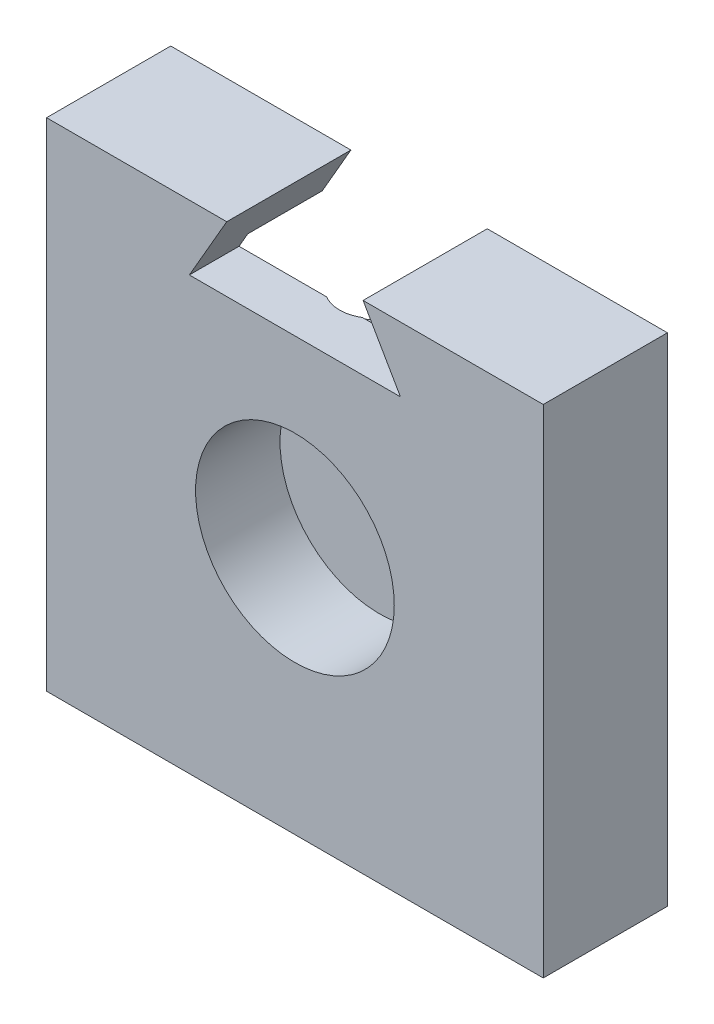
ISO-10303-21;
HEADER;
FILE_DESCRIPTION(('STEP AP214'),'2;1');
FILE_NAME('part.step','',(''),(''),'','','');
FILE_SCHEMA(('AUTOMOTIVE_DESIGN { 1 0 10303 214 1 1 1 1 }'));
ENDSEC;
DATA;
#1=APPLICATION_CONTEXT('core data for automotive mechanical design processes');
#2=APPLICATION_PROTOCOL_DEFINITION('international standard','automotive_design',2000,#1);
#3=PRODUCT_CONTEXT('',#1,'mechanical');
#4=PRODUCT('Part','Part','',(#3));
#5=PRODUCT_RELATED_PRODUCT_CATEGORY('part','',(#4));
#6=PRODUCT_DEFINITION_FORMATION('','',#4);
#7=PRODUCT_DEFINITION_CONTEXT('part definition',#1,'design');
#8=PRODUCT_DEFINITION('design','',#6,#7);
#9=PRODUCT_DEFINITION_SHAPE('','',#8);
#10=(LENGTH_UNIT() NAMED_UNIT(*) SI_UNIT(.MILLI.,.METRE.));
#11=(NAMED_UNIT(*) PLANE_ANGLE_UNIT() SI_UNIT($,.RADIAN.));
#12=(NAMED_UNIT(*) SI_UNIT($,.STERADIAN.) SOLID_ANGLE_UNIT());
#13=UNCERTAINTY_MEASURE_WITH_UNIT(LENGTH_MEASURE(1.E-05),#10,'distance_accuracy_value','');
#14=(GEOMETRIC_REPRESENTATION_CONTEXT(3) GLOBAL_UNCERTAINTY_ASSIGNED_CONTEXT((#13)) GLOBAL_UNIT_ASSIGNED_CONTEXT((#10,
#11,#12)) REPRESENTATION_CONTEXT('',''));
#15=CARTESIAN_POINT('',(0.,0.,0.));
#16=DIRECTION('',(0.,0.,1.));
#17=DIRECTION('',(1.,0.,0.));
#18=AXIS2_PLACEMENT_3D('',#15,#16,#17);
#19=CARTESIAN_POINT('',(0.,0.,-20.));
#20=DIRECTION('',(0.,0.,-1.));
#21=DIRECTION('',(-1.,0.,0.));
#22=AXIS2_PLACEMENT_3D('',#19,#20,#21);
#23=PLANE('',#22);
#24=DIRECTION('',(-1.,0.,0.));
#25=VECTOR('',#24,1.);
#26=CARTESIAN_POINT('',(0.,-51.1575796374062,-20.));
#27=LINE('',#26,#25);
#28=CARTESIAN_POINT('',(-47.8900493387996,-51.1575796374062,-20.));
#29=VERTEX_POINT('',#28);
#30=CARTESIAN_POINT('',(-83.1789467878717,-51.1575796374062,-20.));
#31=VERTEX_POINT('',#30);
#32=EDGE_CURVE('E294',#29,#31,#27,.T.);
#33=ORIENTED_EDGE('',*,*,#32,.F.);
#34=DIRECTION('',(0.,1.,0.));
#35=VECTOR('',#34,1.);
#36=CARTESIAN_POINT('',(-47.8900493387996,-91.0679289380284,-20.));
#37=LINE('',#36,#35);
#38=CARTESIAN_POINT('',(-47.8900493387996,-75.5906614306165,-20.));
#39=VERTEX_POINT('',#38);
#40=EDGE_CURVE('E314',#29,#39,#37,.F.);
#41=ORIENTED_EDGE('',*,*,#40,.T.);
#42=CARTESIAN_POINT('',(-40.6789467878717,-125.067928938028,-20.));
#43=DIRECTION('',(0.,0.,-1.));
#44=DIRECTION('',(-1.,0.,0.));
#45=AXIS2_PLACEMENT_3D('',#42,#43,#44);
#46=CIRCLE('',#45,50.);
#47=CARTESIAN_POINT('',(-33.4678442369437,-75.5906614306165,-20.));
#48=VERTEX_POINT('',#47);
#49=EDGE_CURVE('E184',#48,#39,#46,.T.);
#50=ORIENTED_EDGE('',*,*,#49,.F.);
#51=DIRECTION('',(0.,1.,0.));
#52=VECTOR('',#51,1.);
#53=CARTESIAN_POINT('',(-33.4678442369437,-91.0679289380284,-20.));
#54=LINE('',#53,#52);
#55=CARTESIAN_POINT('',(-33.4678442369437,-51.1575796374062,-20.));
#56=VERTEX_POINT('',#55);
#57=EDGE_CURVE('E60',#48,#56,#54,.T.);
#58=ORIENTED_EDGE('',*,*,#57,.T.);
#59=CARTESIAN_POINT('',(1.82105321212831,-51.1575796374062,-20.));
#60=VERTEX_POINT('',#59);
#61=EDGE_CURVE('E295',#60,#56,#27,.T.);
#62=ORIENTED_EDGE('',*,*,#61,.F.);
#63=DIRECTION('',(0.499671019319952,-0.866215257572712,0.));
#64=VECTOR('',#63,1.);
#65=CARTESIAN_POINT('',(-20.7757709303981,-11.984377494157,-20.));
#66=LINE('',#65,#64);
#67=CARTESIAN_POINT('',(-1.69172487121677,-45.0679289380284,-20.));
#68=VERTEX_POINT('',#67);
#69=EDGE_CURVE('E172',#68,#60,#66,.T.);
#70=ORIENTED_EDGE('',*,*,#69,.F.);
#71=DIRECTION('',(1.,0.,0.));
#72=VECTOR('',#71,1.);
#73=CARTESIAN_POINT('',(-140.678946787872,-45.0679289380284,-20.));
#74=LINE('',#73,#72);
#75=CARTESIAN_POINT('',(39.3210532121283,-45.0679289380284,-20.));
#76=VERTEX_POINT('',#75);
#77=EDGE_CURVE('E240',#68,#76,#74,.T.);
#78=ORIENTED_EDGE('',*,*,#77,.T.);
#79=DIRECTION('',(0.,-1.,0.));
#80=VECTOR('',#79,1.);
#81=CARTESIAN_POINT('',(39.3210532121283,-25.0679289380284,-20.));
#82=LINE('',#81,#80);
#83=CARTESIAN_POINT('',(39.3210532121283,-205.067928938028,-20.));
#84=VERTEX_POINT('',#83);
#85=EDGE_CURVE('E246',#76,#84,#82,.T.);
#86=ORIENTED_EDGE('',*,*,#85,.T.);
#87=DIRECTION('',(-1.,0.,0.));
#88=VECTOR('',#87,1.);
#89=CARTESIAN_POINT('',(59.3210532121283,-205.067928938028,-20.));
#90=LINE('',#89,#88);
#91=CARTESIAN_POINT('',(-120.678946787872,-205.067928938028,-20.));
#92=VERTEX_POINT('',#91);
#93=EDGE_CURVE('E225',#84,#92,#90,.T.);
#94=ORIENTED_EDGE('',*,*,#93,.T.);
#95=DIRECTION('',(0.,1.,0.));
#96=VECTOR('',#95,1.);
#97=CARTESIAN_POINT('',(-120.678946787872,-225.067928938028,-20.));
#98=LINE('',#97,#96);
#99=CARTESIAN_POINT('',(-120.678946787872,-45.0679289380284,-20.));
#100=VERTEX_POINT('',#99);
#101=EDGE_CURVE('E228',#92,#100,#98,.T.);
#102=ORIENTED_EDGE('',*,*,#101,.T.);
#103=CARTESIAN_POINT('',(-79.6661687045266,-45.0679289380284,-20.));
#104=VERTEX_POINT('',#103);
#105=EDGE_CURVE('E243',#100,#104,#74,.T.);
#106=ORIENTED_EDGE('',*,*,#105,.T.);
#107=DIRECTION('',(0.499671019319952,0.866215257572712,0.));
#108=VECTOR('',#107,1.);
#109=CARTESIAN_POINT('',(-40.2694056213398,23.2291624723943,-20.));
#110=LINE('',#109,#108);
#111=EDGE_CURVE('E292',#31,#104,#110,.T.);
#112=ORIENTED_EDGE('',*,*,#111,.F.);
#113=EDGE_LOOP('',(#33,#41,#50,#58,#62,#70,#78,#86,#94,#102,#106,#112));
#114=FACE_BOUND('',#113,.T.);
#115=ADVANCED_FACE('F45',(#114),#23,.T.);
#116=CARTESIAN_POINT('',(-40.6789467878717,-125.067928938028,-48.));
#117=DIRECTION('',(0.,0.,1.));
#118=DIRECTION('',(1.,0.,0.));
#119=AXIS2_PLACEMENT_3D('',#116,#117,#118);
#120=CYLINDRICAL_SURFACE('',#119,50.);
#121=CARTESIAN_POINT('',(-40.6789467878717,-125.067928938028,-48.));
#122=DIRECTION('',(0.,0.,-1.));
#123=DIRECTION('',(-1.,0.,0.));
#124=AXIS2_PLACEMENT_3D('',#121,#122,#123);
#125=CIRCLE('',#124,50.);
#126=CARTESIAN_POINT('',(-90.6789467878717,-125.067928938028,-48.));
#127=VERTEX_POINT('',#126);
#128=EDGE_CURVE('E188',#127,#127,#125,.T.);
#129=ORIENTED_EDGE('',*,*,#128,.F.);
#130=EDGE_LOOP('',(#129));
#131=FACE_BOUND('',#130,.T.);
#132=CARTESIAN_POINT('',(-33.4678442369437,-75.5906614306165,-20.));
#133=CARTESIAN_POINT('',(-33.127491316816,-75.6402471889574,-20.2044894788464));
#134=CARTESIAN_POINT('',(-32.7961409342557,-75.6921457093669,-20.4233485575256));
#135=CARTESIAN_POINT('',(-32.1535447080978,-75.7990432151271,-20.8880923771048));
#136=CARTESIAN_POINT('',(-31.8422969448416,-75.8540419034914,-21.1339745314153));
#137=CARTESIAN_POINT('',(-31.241886644947,-75.9656345810501,-21.6511362777683));
#138=CARTESIAN_POINT('',(-30.9527280089848,-76.0222288496003,-21.922420336745));
#139=CARTESIAN_POINT('',(-30.3984429104177,-76.1354118117918,-22.4885253585679));
#140=CARTESIAN_POINT('',(-30.1333166606777,-76.1920005053794,-22.7833465298488));
#141=CARTESIAN_POINT('',(-29.6287811497784,-76.3035910595975,-23.3947117888761));
#142=CARTESIAN_POINT('',(-29.3893820223403,-76.3585922887437,-23.7112643565851));
#143=CARTESIAN_POINT('',(-28.9380954011335,-76.465396157749,-24.3639143931286));
#144=CARTESIAN_POINT('',(-28.7262073581621,-76.5171988614492,-24.7000114716028));
#145=CARTESIAN_POINT('',(-28.3315744979307,-76.6160581711186,-25.3893965050593));
#146=CARTESIAN_POINT('',(-28.1488182905143,-76.6631166293658,-25.7426776704326));
#147=CARTESIAN_POINT('',(-27.8137801149928,-76.7510839861762,-26.4641470482064));
#148=CARTESIAN_POINT('',(-27.6614976429538,-76.791992986428,-26.832335013977));
#149=CARTESIAN_POINT('',(-27.3900616618789,-76.8660084720104,-27.5772117266611));
#150=CARTESIAN_POINT('',(-27.2705867613576,-76.8991901288862,-27.9537758220139));
#151=CARTESIAN_POINT('',(-27.0637679636828,-76.957239269485,-28.7162618326095));
#152=CARTESIAN_POINT('',(-26.9764239327672,-76.9821067878201,-29.1021837088883));
#153=CARTESIAN_POINT('',(-26.8346676226539,-77.0227274878852,-29.8804765124768));
#154=CARTESIAN_POINT('',(-26.7802528353505,-77.0384813637655,-30.2728469462835));
#155=CARTESIAN_POINT('',(-26.7048601873649,-77.0603622716572,-31.0610502343464));
#156=CARTESIAN_POINT('',(-26.6838813444366,-77.0664895864675,-31.4568829865467));
#157=CARTESIAN_POINT('',(-26.6757086137781,-77.06887352079,-32.2345731764005));
#158=CARTESIAN_POINT('',(-26.6873186009669,-77.0654796056493,-32.6164175316384));
#159=CARTESIAN_POINT('',(-26.741673341622,-77.0496698082645,-33.3776871712095));
#160=CARTESIAN_POINT('',(-26.7844172865947,-77.0372541602987,-33.7571125181019));
#161=CARTESIAN_POINT('',(-26.900657976288,-77.0037800954152,-34.5108057828067));
#162=CARTESIAN_POINT('',(-26.9741528218142,-76.9827222122487,-34.8850740176511));
#163=CARTESIAN_POINT('',(-27.151265652443,-76.9325957575443,-35.6258629231449));
#164=CARTESIAN_POINT('',(-27.2548839196588,-76.9035271109838,-35.9923835212014));
#165=CARTESIAN_POINT('',(-27.4909512858752,-76.838356110846,-36.7138413361672));
#166=CARTESIAN_POINT('',(-27.623291383925,-76.8022804024012,-37.0688166657969));
#167=CARTESIAN_POINT('',(-27.9160036510965,-76.724054291953,-37.7663099782711));
#168=CARTESIAN_POINT('',(-28.0763756352617,-76.681903930031,-38.1088280432914));
#169=CARTESIAN_POINT('',(-28.4240141272761,-76.5926897354577,-38.7793255941735));
#170=CARTESIAN_POINT('',(-28.6112848375631,-76.5456251353602,-39.1073027977918));
#171=CARTESIAN_POINT('',(-29.0114273238514,-76.4478570067085,-39.7466920598263));
#172=CARTESIAN_POINT('',(-29.2243004699536,-76.3971532834671,-40.0581032304324));
#173=CARTESIAN_POINT('',(-29.6820184097702,-76.2916581742724,-40.6729147190777));
#174=CARTESIAN_POINT('',(-29.9277118194955,-76.2367861494465,-40.9756697671794));
#175=CARTESIAN_POINT('',(-30.4433877900566,-76.1260975516321,-41.5595528918814));
#176=CARTESIAN_POINT('',(-30.7133708696605,-76.0702809584907,-41.8406805063344));
#177=CARTESIAN_POINT('',(-31.2759340935544,-75.9592174131639,-42.3795513212423));
#178=CARTESIAN_POINT('',(-31.5685175694197,-75.903970546329,-42.6372910618129));
#179=CARTESIAN_POINT('',(-32.1743857845653,-75.7955519677415,-43.1276375961776));
#180=CARTESIAN_POINT('',(-32.4876699968796,-75.742380203219,-43.3602450293527));
#181=CARTESIAN_POINT('',(-33.1393429071357,-75.6385312960618,-43.8030762417714));
#182=CARTESIAN_POINT('',(-33.4781052826024,-75.587924185755,-44.0127670527731));
#183=CARTESIAN_POINT('',(-34.1728319823824,-75.4917912825997,-44.4027884128501));
#184=CARTESIAN_POINT('',(-34.5287965992393,-75.4462655762099,-44.5831184623843));
#185=CARTESIAN_POINT('',(-35.2554106634913,-75.3616013541961,-44.912955453791));
#186=CARTESIAN_POINT('',(-35.6260580580199,-75.3224619495636,-45.062466686577));
#187=CARTESIAN_POINT('',(-36.3794194400909,-75.25169488883,-45.3294319475032));
#188=CARTESIAN_POINT('',(-36.7621330811476,-75.2200670172552,-45.4468868952151));
#189=CARTESIAN_POINT('',(-37.5276745318652,-75.1658923926653,-45.6463271839084));
#190=CARTESIAN_POINT('',(-37.9102882483406,-75.143149676105,-45.7290812898155));
#191=CARTESIAN_POINT('',(-38.6815109708656,-75.1063510505131,-45.8623004186971));
#192=CARTESIAN_POINT('',(-39.0701198940762,-75.0922950215628,-45.9127658874128));
#193=CARTESIAN_POINT('',(-39.8503575907757,-75.073272253623,-45.9809431310111));
#194=CARTESIAN_POINT('',(-40.2419858522099,-75.0683040060515,-45.9986603421469));
#195=CARTESIAN_POINT('',(-41.0253537930084,-75.0675948700836,-46.0011932286472));
#196=CARTESIAN_POINT('',(-41.4170934702926,-75.0718538194445,-45.986009482512));
#197=CARTESIAN_POINT('',(-42.1863694902106,-75.0892195104766,-45.9238014576786));
#198=CARTESIAN_POINT('',(-42.5639879542834,-75.102065740952,-45.8777145595874));
#199=CARTESIAN_POINT('',(-43.3138553917301,-75.135994090932,-45.7550568192374));
#200=CARTESIAN_POINT('',(-43.6861044853422,-75.1570760257136,-45.6784866607029));
#201=CARTESIAN_POINT('',(-44.4226717624374,-75.2069141560362,-45.4955005909293));
#202=CARTESIAN_POINT('',(-44.7869897342815,-75.2356705560966,-45.3890838842961));
#203=CARTESIAN_POINT('',(-45.5052425869253,-75.3000990108522,-45.1472608372649));
#204=CARTESIAN_POINT('',(-45.8591773025915,-75.3357711754659,-45.0118540360975));
#205=CARTESIAN_POINT('',(-46.557323755629,-75.4134316123655,-44.7118162108455));
#206=CARTESIAN_POINT('',(-46.9014269851234,-75.4554710996774,-44.5469460668976));
#207=CARTESIAN_POINT('',(-47.5745346330975,-75.5445391185646,-44.1899957576888));
#208=CARTESIAN_POINT('',(-47.903539020103,-75.5915676605393,-43.9979155357105));
#209=CARTESIAN_POINT('',(-48.5444660636204,-75.6894039692955,-43.5878542139308));
#210=CARTESIAN_POINT('',(-48.8563860079258,-75.7402123331332,-43.3698690189479));
#211=CARTESIAN_POINT('',(-49.4612108948627,-75.8442961707931,-42.9094591365338));
#212=CARTESIAN_POINT('',(-49.7541149228678,-75.897571763073,-42.6670332749868));
#213=CARTESIAN_POINT('',(-50.3286754835553,-76.0070368411117,-42.1507092170427));
#214=CARTESIAN_POINT('',(-50.6096190509435,-76.0632639925612,-41.8760251008811));
#215=CARTESIAN_POINT('',(-51.1474758743086,-76.1753386395193,-41.3039797036671));
#216=CARTESIAN_POINT('',(-51.4043885822821,-76.231186126343,-41.0066179057499));
#217=CARTESIAN_POINT('',(-51.8925028492467,-76.3409470710717,-40.3910938140397));
#218=CARTESIAN_POINT('',(-52.1237013901111,-76.394860301447,-40.0729290855066));
#219=CARTESIAN_POINT('',(-52.5587411546701,-76.4992091531165,-39.4178880456625));
#220=CARTESIAN_POINT('',(-52.7625834031294,-76.5496449046423,-39.0810124359285));
#221=CARTESIAN_POINT('',(-53.1432785690779,-76.6460394019567,-38.3873676517446));
#222=CARTESIAN_POINT('',(-53.3198489534954,-76.6919497007434,-38.0304365352569));
#223=CARTESIAN_POINT('',(-53.6421857078636,-76.7773267768186,-37.3021694875347));
#224=CARTESIAN_POINT('',(-53.7879517581163,-76.8167934872324,-36.9308334068477));
#225=CARTESIAN_POINT('',(-54.0474164934617,-76.8880354884619,-36.1764897344829));
#226=CARTESIAN_POINT('',(-54.1611223550068,-76.9198125003375,-35.7934847761059));
#227=CARTESIAN_POINT('',(-54.3554881353464,-76.9746608493087,-35.0185703875796));
#228=CARTESIAN_POINT('',(-54.4361491777594,-76.99773248241,-34.626661260676));
#229=CARTESIAN_POINT('',(-54.5616562518505,-77.0338316430497,-33.8494343629358));
#230=CARTESIAN_POINT('',(-54.6075537824555,-77.0471536068278,-33.4642998213667));
#231=CARTESIAN_POINT('',(-54.6672379114782,-77.064505238644,-32.6913438084959));
#232=CARTESIAN_POINT('',(-54.6810251689245,-77.0685350973924,-32.3035223925033));
#233=CARTESIAN_POINT('',(-54.6763623925297,-77.0671751926075,-31.5281429830941));
#234=CARTESIAN_POINT('',(-54.6579166109107,-77.0617866715583,-31.1405849616774));
#235=CARTESIAN_POINT('',(-54.5889662599281,-77.0417627030917,-30.3685766055623));
#236=CARTESIAN_POINT('',(-54.5384620013247,-77.0271273453088,-29.9841262407763));
#237=CARTESIAN_POINT('',(-54.4074364022875,-76.9895233276988,-29.230262598024));
#238=CARTESIAN_POINT('',(-54.3276590508815,-76.9667615620284,-28.8607093039045));
#239=CARTESIAN_POINT('',(-54.1386626020343,-76.9135347750254,-28.1297880614728));
#240=CARTESIAN_POINT('',(-54.0294439602713,-76.8830698729188,-27.7684199865677));
#241=CARTESIAN_POINT('',(-53.7824071151424,-76.8153049753024,-27.0561708879822));
#242=CARTESIAN_POINT('',(-53.6445823908391,-76.7780034215619,-26.7052922763418));
#243=CARTESIAN_POINT('',(-53.3413897419005,-76.6976165617643,-26.0163395138254));
#244=CARTESIAN_POINT('',(-53.1760216113235,-76.6545312124624,-25.678265458712));
#245=CARTESIAN_POINT('',(-52.8149345555696,-76.5627410182707,-25.0096236154218));
#246=CARTESIAN_POINT('',(-52.6186214732144,-76.5139323536964,-24.6793909157073));
#247=CARTESIAN_POINT('',(-52.1998101610415,-76.412856223123,-24.0365273648616));
#248=CARTESIAN_POINT('',(-51.9773110978249,-76.3605886470634,-23.7238970744156));
#249=CARTESIAN_POINT('',(-51.507698379323,-76.2540369668398,-23.1182842432341));
#250=CARTESIAN_POINT('',(-51.2605955319544,-76.1997537546159,-22.8252931692237));
#251=CARTESIAN_POINT('',(-50.7433719150203,-76.090615550472,-22.2607005476793));
#252=CARTESIAN_POINT('',(-50.4732568533018,-76.0357607032835,-21.9890937280644));
#253=CARTESIAN_POINT('',(-49.8397267211237,-75.9129808165579,-21.4023148510164));
#254=CARTESIAN_POINT('',(-49.4701001011118,-75.8452950807162,-21.0937284296249));
#255=CARTESIAN_POINT('',(-48.8934574381244,-75.7469410329377,-20.6607060016626));
#256=CARTESIAN_POINT('',(-48.6976731255036,-75.7147047608292,-20.5214197880979));
#257=CARTESIAN_POINT('',(-48.2990508180705,-75.6515880421404,-20.2530127327718));
#258=CARTESIAN_POINT('',(-48.0962129486482,-75.6207075714803,-20.1238917104387));
#259=CARTESIAN_POINT('',(-47.8900493387996,-75.5906614306165,-20.));
#260=B_SPLINE_CURVE_WITH_KNOTS('',3,(#132,#133,#134,#135,#136,#137,#138,#139,#140,#141,#142,
#143,#144,#145,#146,#147,#148,#149,#150,#151,#152,#153,#154,#155,#156,#157,#158,#159,#160,#161,
#162,#163,#164,#165,#166,#167,#168,#169,#170,#171,#172,#173,#174,#175,#176,#177,#178,#179,#180,
#181,#182,#183,#184,#185,#186,#187,#188,#189,#190,#191,#192,#193,#194,#195,#196,#197,#198,#199,
#200,#201,#202,#203,#204,#205,#206,#207,#208,#209,#210,#211,#212,#213,#214,#215,#216,#217,#218,
#219,#220,#221,#222,#223,#224,#225,#226,#227,#228,#229,#230,#231,#232,#233,#234,#235,#236,#237,
#238,#239,#240,#241,#242,#243,#244,#245,#246,#247,#248,#249,#250,#251,#252,#253,#254,#255,#256,
#257,#258,#259),.UNSPECIFIED.,.F.,.F.,(4,2,2,2,2,2,2,2,2,2,2,2,2,2,2,2,2,2,2,2,2,2,2,2,2,2,2,2,
2,2,2,2,2,2,2,2,2,2,2,2,2,2,2,2,2,2,2,2,2,2,2,2,2,2,2,2,2,2,2,2,2,2,2,4),(0.,1.20002969374516,
2.39994462315538,3.60007095574235,4.80020791731961,6.00081588446096,7.20139988023009,
8.40151330626645,9.60160688479269,10.7894867062625,11.9773615824821,13.1651459710269,
14.3528954654454,15.4976262964194,16.6423274018253,17.7869578202268,18.9315989587161,
20.0719698001751,21.2123331176714,22.352874790421,23.4934775258396,24.6733628962982,
25.8532734722222,27.0333583145794,28.2134131277941,29.4167799902127,30.6201673244605,
31.8233869973716,33.0265721509037,34.2014786904781,35.3763690102495,36.5510642791895,
37.7257388935278,38.866303586243,40.006842698104,41.1474122075919,42.2879998466688,
43.4383035431376,44.5886096373661,45.7390978199712,46.8896412977476,48.0790054661416,
49.2683967503689,50.4579274889976,51.6474136554495,52.8484976708549,54.0495941509173,
55.2504215599736,56.4512081340639,57.6140385359592,58.7768450718111,59.9394982203785,
61.1021400988923,62.2370761436368,63.3719946234022,64.5071720997211,65.6423580641229,
66.8028374511857,67.9633537818261,69.123362552866,70.2830844335548,71.7389445994941,
72.4659589145674,73.1929603122376),.UNSPECIFIED.);
#261=EDGE_CURVE('E315',#48,#39,#260,.T.);
#262=ORIENTED_EDGE('',*,*,#261,.F.);
#263=ORIENTED_EDGE('',*,*,#49,.T.);
#264=EDGE_LOOP('',(#262,#263));
#265=FACE_BOUND('',#264,.T.);
#266=ADVANCED_FACE('F330',(#131,#265),#120,.T.);
#267=CARTESIAN_POINT('',(-40.6789467878717,-125.067928938028,-34.));
#268=DIRECTION('',(0.,0.,1.));
#269=DIRECTION('',(1.,0.,0.));
#270=AXIS2_PLACEMENT_3D('',#267,#268,#269);
#271=CYLINDRICAL_SURFACE('',#270,40.);
#272=CARTESIAN_POINT('',(-40.6789467878717,-125.067928938028,0.));
#273=DIRECTION('',(0.,0.,1.));
#274=DIRECTION('',(1.,0.,0.));
#275=AXIS2_PLACEMENT_3D('',#272,#273,#274);
#276=CIRCLE('',#275,40.);
#277=CARTESIAN_POINT('',(-0.678946787871684,-125.067928938028,0.));
#278=VERTEX_POINT('',#277);
#279=EDGE_CURVE('E185',#278,#278,#276,.T.);
#280=ORIENTED_EDGE('',*,*,#279,.T.);
#281=EDGE_LOOP('',(#280));
#282=FACE_BOUND('',#281,.T.);
#283=CARTESIAN_POINT('',(-26.8225403273207,-87.544602859441,-34.));
#284=CARTESIAN_POINT('',(-26.795836281394,-87.5544658711971,-33.8149915284921));
#285=CARTESIAN_POINT('',(-26.7728320814616,-87.5629909747125,-33.629400252426));
#286=CARTESIAN_POINT('',(-26.7342678074937,-87.5773117596002,-33.2573437638973));
#287=CARTESIAN_POINT('',(-26.7187076338813,-87.5831074774827,-33.0708785631587));
#288=CARTESIAN_POINT('',(-26.6832668424184,-87.5963175207388,-32.510728004493));
#289=CARTESIAN_POINT('',(-26.674607896232,-87.5995614553862,-32.1361625947314));
#290=CARTESIAN_POINT('',(-26.6873170573888,-87.5948143093527,-31.3887145737689));
#291=CARTESIAN_POINT('',(-26.7086010979263,-87.5868546833362,-31.0158301881418));
#292=CARTESIAN_POINT('',(-26.7808265568174,-87.5600132850827,-30.2733383507084));
#293=CARTESIAN_POINT('',(-26.8317675950862,-87.5411316528225,-29.9037308569669));
#294=CARTESIAN_POINT('',(-26.9628209398641,-87.4930337308113,-29.1703971156249));
#295=CARTESIAN_POINT('',(-27.0429350170145,-87.4638168137691,-28.8066712264049));
#296=CARTESIAN_POINT('',(-27.2316039098769,-87.39593661335,-28.0875634407401));
#297=CARTESIAN_POINT('',(-27.3401603020369,-87.3572728063764,-27.7321820079865));
#298=CARTESIAN_POINT('',(-27.5848240027895,-87.2716230895688,-27.0319472970164));
#299=CARTESIAN_POINT('',(-27.7209402818661,-87.2246344707108,-26.6870974889122));
#300=CARTESIAN_POINT('',(-28.0196313615529,-87.1236728642558,-26.010123338864));
#301=CARTESIAN_POINT('',(-28.182206594323,-87.0696997625826,-25.6779992048807));
#302=CARTESIAN_POINT('',(-28.5372098053766,-86.9547564402866,-25.0199131908058));
#303=CARTESIAN_POINT('',(-28.7303043640494,-86.8936407197123,-24.6943363846514));
#304=CARTESIAN_POINT('',(-29.1418486534073,-86.7672539956384,-24.0603367756558));
#305=CARTESIAN_POINT('',(-29.3603064498568,-86.7019816732936,-23.7519194760868));
#306=CARTESIAN_POINT('',(-29.8211874032935,-86.5690123484664,-23.1540085880515));
#307=CARTESIAN_POINT('',(-30.0636150907209,-86.5013148891677,-22.8645185941918));
#308=CARTESIAN_POINT('',(-30.5709687578852,-86.3652448539666,-22.3061310730415));
#309=CARTESIAN_POINT('',(-30.8358957377386,-86.2968722481729,-22.0372344621591));
#310=CARTESIAN_POINT('',(-31.4013881553686,-86.1575688685025,-21.5078716040295));
#311=CARTESIAN_POINT('',(-31.7030992605079,-86.0866952007231,-21.2486124564999));
#312=CARTESIAN_POINT('',(-32.3278283120517,-85.9480983474285,-20.7564733781508));
#313=CARTESIAN_POINT('',(-32.6508390558127,-85.8803741099848,-20.5235846016311));
#314=CARTESIAN_POINT('',(-33.316284492897,-85.7499158228309,-20.0857292610212));
#315=CARTESIAN_POINT('',(-33.6587214620011,-85.6871823598663,-19.8807659780076));
#316=CARTESIAN_POINT('',(-34.3607612604385,-85.5684701671287,-19.5004039135354));
#317=CARTESIAN_POINT('',(-34.720363659107,-85.5124912680141,-19.3250043908489));
#318=CARTESIAN_POINT('',(-35.4510860849259,-85.4093306980213,-19.0066593420814));
#319=CARTESIAN_POINT('',(-35.8220781375715,-85.3620764851891,-18.8634438284973));
#320=CARTESIAN_POINT('',(-36.5759036662354,-85.2771149133386,-18.6088351793189));
#321=CARTESIAN_POINT('',(-36.9587371449252,-85.239407556474,-18.4974420509033));
#322=CARTESIAN_POINT('',(-37.733252342831,-85.1746482647482,-18.3076002781631));
#323=CARTESIAN_POINT('',(-38.1249312719486,-85.1475930182148,-18.2291413942918));
#324=CARTESIAN_POINT('',(-38.914166977101,-85.1049248742788,-18.1059348406217));
#325=CARTESIAN_POINT('',(-39.3117234739227,-85.0893114351055,-18.0611855746658));
#326=CARTESIAN_POINT('',(-40.0888536806504,-85.0704916872224,-18.0073028714053));
#327=CARTESIAN_POINT('',(-40.4682945294548,-85.0666856878903,-17.9964477774559));
#328=CARTESIAN_POINT('',(-41.2267504292507,-85.0698826354073,-18.0055821363781));
#329=CARTESIAN_POINT('',(-41.6057654954772,-85.0768851823282,-18.0255704480092));
#330=CARTESIAN_POINT('',(-42.3605435320183,-85.1015079462189,-18.09619128569));
#331=CARTESIAN_POINT('',(-42.7363067719205,-85.1191272742989,-18.1468212462699));
#332=CARTESIAN_POINT('',(-43.4818960119255,-85.1645083759371,-18.2782373321847));
#333=CARTESIAN_POINT('',(-43.8517219896342,-85.1922701877415,-18.3590235712352));
#334=CARTESIAN_POINT('',(-44.5768473521125,-85.2566654261313,-18.548439039279));
#335=CARTESIAN_POINT('',(-44.932285484413,-85.2931459737631,-18.6565901716562));
#336=CARTESIAN_POINT('',(-45.6326089636525,-85.3742833602811,-18.9004308937196));
#337=CARTESIAN_POINT('',(-45.9774944889888,-85.4189400608559,-19.0361200175656));
#338=CARTESIAN_POINT('',(-46.6545898808724,-85.5153229954916,-19.3339634405401));
#339=CARTESIAN_POINT('',(-46.9868002292349,-85.567048960489,-19.4961167324601));
#340=CARTESIAN_POINT('',(-47.636751081917,-85.6763357328897,-19.8457745632019));
#341=CARTESIAN_POINT('',(-47.9544859432475,-85.7338987880348,-20.033288877373));
#342=CARTESIAN_POINT('',(-48.5861392795667,-85.8558909305899,-20.4404517083245));
#343=CARTESIAN_POINT('',(-48.8993817577836,-85.920503694519,-20.6610942438938));
#344=CARTESIAN_POINT('',(-49.5064632838961,-86.0529121082741,-21.1270316601522));
#345=CARTESIAN_POINT('',(-49.8002934349275,-86.1207091934848,-21.3723377162698));
#346=CARTESIAN_POINT('',(-50.3668023234596,-86.2577444479269,-21.8860636648969));
#347=CARTESIAN_POINT('',(-50.6394747249295,-86.3269830410283,-22.1544904308862));
#348=CARTESIAN_POINT('',(-51.1618752592678,-86.4650638992119,-22.7126820181113));
#349=CARTESIAN_POINT('',(-51.4116130045112,-86.5339063188937,-23.0024378073421));
#350=CARTESIAN_POINT('',(-51.8970484986024,-86.6723480056833,-23.6146953527859));
#351=CARTESIAN_POINT('',(-52.1316727277446,-86.7418513578251,-23.9380711801558));
#352=CARTESIAN_POINT('',(-52.5727192185004,-86.8764202139232,-24.6042118519398));
#353=CARTESIAN_POINT('',(-52.7791521942479,-86.9414873991178,-24.9469692599249));
#354=CARTESIAN_POINT('',(-53.1623953826549,-87.0652436187426,-25.6498984211071));
#355=CARTESIAN_POINT('',(-53.3391978076857,-87.1239309749791,-26.0100747204613));
#356=CARTESIAN_POINT('',(-53.6616092930849,-87.2330315148831,-26.7453272008829));
#357=CARTESIAN_POINT('',(-53.8072203532322,-87.2834452289517,-27.1204024249035));
#358=CARTESIAN_POINT('',(-54.0632564681331,-87.3733894897613,-27.8749877789488));
#359=CARTESIAN_POINT('',(-54.1743405956664,-87.4131216390327,-28.2542500776507));
#360=CARTESIAN_POINT('',(-54.3642163052288,-87.4817132428431,-29.0217971263457));
#361=CARTESIAN_POINT('',(-54.4430045753353,-87.5105715822544,-29.4100827973684));
#362=CARTESIAN_POINT('',(-54.5673604330784,-87.5563791242942,-30.19209684092));
#363=CARTESIAN_POINT('',(-54.6129725018232,-87.5733442716526,-30.5858172020296));
#364=CARTESIAN_POINT('',(-54.6706320296494,-87.5948227790225,-31.3758826039137));
#365=CARTESIAN_POINT('',(-54.6826960263478,-87.5993422741428,-31.7722262549065));
#366=CARTESIAN_POINT('',(-54.6742470106827,-87.5961846070381,-32.475128770164));
#367=CARTESIAN_POINT('',(-54.6604605159652,-87.591025674847,-32.7818000399768));
#368=CARTESIAN_POINT('',(-54.6128573369895,-87.5733103503157,-33.3928464239945));
#369=CARTESIAN_POINT('',(-54.5790746282886,-87.5607665058699,-33.6972245481559));
#370=CARTESIAN_POINT('',(-54.5353532484227,-87.544602859441,-34.));
#371=B_SPLINE_CURVE_WITH_KNOTS('',3,(#283,#284,#285,#286,#287,#288,#289,#290,#291,#292,#293,
#294,#295,#296,#297,#298,#299,#300,#301,#302,#303,#304,#305,#306,#307,#308,#309,#310,#311,#312,
#313,#314,#315,#316,#317,#318,#319,#320,#321,#322,#323,#324,#325,#326,#327,#328,#329,#330,#331,
#332,#333,#334,#335,#336,#337,#338,#339,#340,#341,#342,#343,#344,#345,#346,#347,#348,#349,#350,
#351,#352,#353,#354,#355,#356,#357,#358,#359,#360,#361,#362,#363,#364,#365,#366,#367,#368,#369,
#370),.UNSPECIFIED.,.F.,.F.,(4,2,2,2,2,2,2,2,2,2,2,2,2,2,2,2,2,2,2,2,2,2,2,2,2,2,2,2,2,2,2,2,2,
2,2,2,2,2,2,2,2,2,2,4),(0.,0.561469968833658,1.12293242682563,2.24547888264041,3.36488000129687,
4.48426677399384,5.60372149857573,6.72323828335318,7.84312004780241,8.96302010536061,
10.1120537827771,11.2614538705102,12.4110716179297,13.5607404938019,14.7714960609033,
15.981844280359,17.1923345860051,18.4027945375058,19.6026858631875,20.8025774595518,
22.0020957222456,23.2015571839461,24.3390092683822,25.4764192668263,26.6137340488726,
27.7510531196402,28.8697297317228,29.9883874215432,31.1070025459309,32.2260500733919,
33.3904291924205,34.5553383082392,35.7205949392956,36.8853609374651,38.100474949572,
39.3151258626401,40.5300955165325,41.7449872514771,42.9350172474127,44.1251692497574,
45.3137225953555,46.5016899362724,47.4220394403718,48.3408296498926),.UNSPECIFIED.);
#372=CARTESIAN_POINT('',(-26.8225403273207,-87.544602859441,-34.));
#373=VERTEX_POINT('',#372);
#374=CARTESIAN_POINT('',(-54.5353532484227,-87.544602859441,-34.));
#375=VERTEX_POINT('',#374);
#376=EDGE_CURVE('E177',#373,#375,#371,.T.);
#377=ORIENTED_EDGE('',*,*,#376,.F.);
#378=CARTESIAN_POINT('',(-40.6789467878717,-125.067928938028,-34.));
#379=DIRECTION('',(0.,0.,1.));
#380=DIRECTION('',(1.,0.,0.));
#381=AXIS2_PLACEMENT_3D('',#378,#379,#380);
#382=CIRCLE('',#381,40.);
#383=EDGE_CURVE('E182',#375,#373,#382,.T.);
#384=ORIENTED_EDGE('',*,*,#383,.F.);
#385=EDGE_LOOP('',(#377,#384));
#386=FACE_BOUND('',#385,.T.);
#387=ADVANCED_FACE('F342',(#282,#386),#271,.F.);
#388=CARTESIAN_POINT('',(-40.6789467878717,-125.067928938028,-34.));
#389=DIRECTION('',(0.,0.,1.));
#390=DIRECTION('',(1.,0.,0.));
#391=AXIS2_PLACEMENT_3D('',#388,#389,#390);
#392=PLANE('',#391);
#393=ORIENTED_EDGE('',*,*,#383,.T.);
#394=DIRECTION('',(0.,1.,0.));
#395=VECTOR('',#394,1.);
#396=CARTESIAN_POINT('',(-26.8225403273207,-91.0679289380284,-34.));
#397=LINE('',#396,#395);
#398=CARTESIAN_POINT('',(-26.8225403273207,-91.0679289380284,-34.));
#399=VERTEX_POINT('',#398);
#400=EDGE_CURVE('E13',#373,#399,#397,.F.);
#401=ORIENTED_EDGE('',*,*,#400,.T.);
#402=DIRECTION('',(1.,0.,0.));
#403=VECTOR('',#402,1.);
#404=CARTESIAN_POINT('',(-40.6789467878717,-91.0679289380284,-34.));
#405=LINE('',#404,#403);
#406=CARTESIAN_POINT('',(-54.5353532484227,-91.0679289380284,-34.));
#407=VERTEX_POINT('',#406);
#408=EDGE_CURVE('E168',#407,#399,#405,.T.);
#409=ORIENTED_EDGE('',*,*,#408,.F.);
#410=DIRECTION('',(0.,1.,0.));
#411=VECTOR('',#410,1.);
#412=CARTESIAN_POINT('',(-54.5353532484227,-91.0679289380284,-34.));
#413=LINE('',#412,#411);
#414=EDGE_CURVE('E53',#407,#375,#413,.T.);
#415=ORIENTED_EDGE('',*,*,#414,.T.);
#416=EDGE_LOOP('',(#393,#401,#409,#415));
#417=FACE_BOUND('',#416,.T.);
#418=ADVANCED_FACE('F180',(#417),#392,.T.);
#419=CARTESIAN_POINT('',(-140.678946787872,-25.0679289380284,-50.));
#420=DIRECTION('',(0.,-1.,0.));
#421=DIRECTION('',(0.,0.,-1.));
#422=AXIS2_PLACEMENT_3D('',#419,#420,#421);
#423=PLANE('',#422);
#424=DIRECTION('',(1.,0.,0.));
#425=VECTOR('',#424,1.);
#426=CARTESIAN_POINT('',(-140.678946787872,-25.0679289380284,-50.));
#427=LINE('',#426,#425);
#428=CARTESIAN_POINT('',(-13.2286036078051,-25.0679289380284,-50.));
#429=VERTEX_POINT('',#428);
#430=CARTESIAN_POINT('',(59.3210532121283,-25.0679289380284,-50.));
#431=VERTEX_POINT('',#430);
#432=EDGE_CURVE('E265',#429,#431,#427,.T.);
#433=ORIENTED_EDGE('',*,*,#432,.F.);
#434=DIRECTION('',(0.,0.,1.));
#435=VECTOR('',#434,1.);
#436=CARTESIAN_POINT('',(-13.2286036078051,-25.0679289380284,-50.));
#437=LINE('',#436,#435);
#438=CARTESIAN_POINT('',(-13.2286036078051,-25.0679289380284,0.));
#439=VERTEX_POINT('',#438);
#440=EDGE_CURVE('E213',#429,#439,#437,.T.);
#441=ORIENTED_EDGE('',*,*,#440,.T.);
#442=DIRECTION('',(1.,0.,0.));
#443=VECTOR('',#442,1.);
#444=CARTESIAN_POINT('',(-140.678946787872,-25.0679289380284,0.));
#445=LINE('',#444,#443);
#446=CARTESIAN_POINT('',(59.3210532121283,-25.0679289380284,0.));
#447=VERTEX_POINT('',#446);
#448=EDGE_CURVE('E276',#439,#447,#445,.T.);
#449=ORIENTED_EDGE('',*,*,#448,.T.);
#450=DIRECTION('',(0.,0.,1.));
#451=VECTOR('',#450,1.);
#452=CARTESIAN_POINT('',(59.3210532121283,-25.0679289380284,-50.));
#453=LINE('',#452,#451);
#454=EDGE_CURVE('E283',#431,#447,#453,.T.);
#455=ORIENTED_EDGE('',*,*,#454,.F.);
#456=EDGE_LOOP('',(#433,#441,#449,#455));
#457=FACE_BOUND('',#456,.T.);
#458=ADVANCED_FACE('F341',(#457),#423,.F.);
#459=CARTESIAN_POINT('',(-140.678946787872,-45.0679289380284,-50.));
#460=DIRECTION('',(0.,-1.,0.));
#461=DIRECTION('',(0.,0.,-1.));
#462=AXIS2_PLACEMENT_3D('',#459,#460,#461);
#463=PLANE('',#462);
#464=DIRECTION('',(0.,0.,1.));
#465=VECTOR('',#464,1.);
#466=CARTESIAN_POINT('',(-1.69172487121677,-45.0679289380284,-50.));
#467=LINE('',#466,#465);
#468=CARTESIAN_POINT('',(-1.69172487121677,-45.0679289380284,-50.));
#469=VERTEX_POINT('',#468);
#470=EDGE_CURVE('E223',#469,#68,#467,.T.);
#471=ORIENTED_EDGE('',*,*,#470,.F.);
#472=DIRECTION('',(1.,0.,0.));
#473=VECTOR('',#472,1.);
#474=CARTESIAN_POINT('',(-140.678946787872,-45.0679289380284,-50.));
#475=LINE('',#474,#473);
#476=CARTESIAN_POINT('',(39.3210532121283,-45.0679289380284,-50.));
#477=VERTEX_POINT('',#476);
#478=EDGE_CURVE('E254',#469,#477,#475,.T.);
#479=ORIENTED_EDGE('',*,*,#478,.T.);
#480=DIRECTION('',(0.,0.,1.));
#481=VECTOR('',#480,1.);
#482=CARTESIAN_POINT('',(39.3210532121283,-45.0679289380284,-50.));
#483=LINE('',#482,#481);
#484=EDGE_CURVE('E237',#477,#76,#483,.T.);
#485=ORIENTED_EDGE('',*,*,#484,.T.);
#486=ORIENTED_EDGE('',*,*,#77,.F.);
#487=EDGE_LOOP('',(#471,#479,#485,#486));
#488=FACE_BOUND('',#487,.T.);
#489=ADVANCED_FACE('F386',(#488),#463,.T.);
#490=CARTESIAN_POINT('',(59.3210532121283,-225.067928938028,-50.));
#491=DIRECTION('',(0.,1.,0.));
#492=DIRECTION('',(0.,0.,1.));
#493=AXIS2_PLACEMENT_3D('',#490,#491,#492);
#494=PLANE('',#493);
#495=DIRECTION('',(-1.,0.,0.));
#496=VECTOR('',#495,1.);
#497=CARTESIAN_POINT('',(59.3210532121283,-225.067928938028,0.));
#498=LINE('',#497,#496);
#499=CARTESIAN_POINT('',(59.3210532121283,-225.067928938028,0.));
#500=VERTEX_POINT('',#499);
#501=CARTESIAN_POINT('',(-140.678946787872,-225.067928938028,0.));
#502=VERTEX_POINT('',#501);
#503=EDGE_CURVE('E232',#500,#502,#498,.T.);
#504=ORIENTED_EDGE('',*,*,#503,.T.);
#505=DIRECTION('',(0.,0.,1.));
#506=VECTOR('',#505,1.);
#507=CARTESIAN_POINT('',(-140.678946787872,-225.067928938028,-50.));
#508=LINE('',#507,#506);
#509=CARTESIAN_POINT('',(-140.678946787872,-225.067928938028,-50.));
#510=VERTEX_POINT('',#509);
#511=EDGE_CURVE('E289',#510,#502,#508,.T.);
#512=ORIENTED_EDGE('',*,*,#511,.F.);
#513=DIRECTION('',(-1.,0.,0.));
#514=VECTOR('',#513,1.);
#515=CARTESIAN_POINT('',(59.3210532121283,-225.067928938028,-50.));
#516=LINE('',#515,#514);
#517=CARTESIAN_POINT('',(59.3210532121283,-225.067928938028,-50.));
#518=VERTEX_POINT('',#517);
#519=EDGE_CURVE('E259',#518,#510,#516,.T.);
#520=ORIENTED_EDGE('',*,*,#519,.F.);
#521=DIRECTION('',(0.,0.,1.));
#522=VECTOR('',#521,1.);
#523=CARTESIAN_POINT('',(59.3210532121283,-225.067928938028,-50.));
#524=LINE('',#523,#522);
#525=EDGE_CURVE('E271',#518,#500,#524,.T.);
#526=ORIENTED_EDGE('',*,*,#525,.T.);
#527=EDGE_LOOP('',(#504,#512,#520,#526));
#528=FACE_BOUND('',#527,.T.);
#529=ADVANCED_FACE('F47',(#528),#494,.F.);
#530=CARTESIAN_POINT('',(-140.678946787872,-225.067928938028,-50.));
#531=DIRECTION('',(1.,0.,0.));
#532=DIRECTION('',(0.,0.,-1.));
#533=AXIS2_PLACEMENT_3D('',#530,#531,#532);
#534=PLANE('',#533);
#535=DIRECTION('',(0.,1.,0.));
#536=VECTOR('',#535,1.);
#537=CARTESIAN_POINT('',(-140.678946787872,-225.067928938028,0.));
#538=LINE('',#537,#536);
#539=CARTESIAN_POINT('',(-140.678946787872,-25.0679289380284,0.));
#540=VERTEX_POINT('',#539);
#541=EDGE_CURVE('E274',#502,#540,#538,.T.);
#542=ORIENTED_EDGE('',*,*,#541,.T.);
#543=DIRECTION('',(0.,0.,1.));
#544=VECTOR('',#543,1.);
#545=CARTESIAN_POINT('',(-140.678946787872,-25.0679289380284,-50.));
#546=LINE('',#545,#544);
#547=CARTESIAN_POINT('',(-140.678946787872,-25.0679289380284,-50.));
#548=VERTEX_POINT('',#547);
#549=EDGE_CURVE('E286',#548,#540,#546,.T.);
#550=ORIENTED_EDGE('',*,*,#549,.F.);
#551=DIRECTION('',(0.,1.,0.));
#552=VECTOR('',#551,1.);
#553=CARTESIAN_POINT('',(-140.678946787872,-225.067928938028,-50.));
#554=LINE('',#553,#552);
#555=EDGE_CURVE('E262',#510,#548,#554,.T.);
#556=ORIENTED_EDGE('',*,*,#555,.F.);
#557=ORIENTED_EDGE('',*,*,#511,.T.);
#558=EDGE_LOOP('',(#542,#550,#556,#557));
#559=FACE_BOUND('',#558,.T.);
#560=ADVANCED_FACE('F379',(#559),#534,.F.);
#561=CARTESIAN_POINT('',(-68.1292899679382,-25.0679289380284,0.));
#562=VERTEX_POINT('',#561);
#563=EDGE_CURVE('E277',#540,#562,#445,.T.);
#564=ORIENTED_EDGE('',*,*,#563,.T.);
#565=DIRECTION('',(0.,0.,1.));
#566=VECTOR('',#565,1.);
#567=CARTESIAN_POINT('',(-68.1292899679382,-25.0679289380284,-50.));
#568=LINE('',#567,#566);
#569=CARTESIAN_POINT('',(-68.1292899679382,-25.0679289380284,-50.));
#570=VERTEX_POINT('',#569);
#571=EDGE_CURVE('E206',#570,#562,#568,.T.);
#572=ORIENTED_EDGE('',*,*,#571,.F.);
#573=EDGE_CURVE('E266',#548,#570,#427,.T.);
#574=ORIENTED_EDGE('',*,*,#573,.F.);
#575=ORIENTED_EDGE('',*,*,#549,.T.);
#576=EDGE_LOOP('',(#564,#572,#574,#575));
#577=FACE_BOUND('',#576,.T.);
#578=ADVANCED_FACE('F376',(#577),#423,.F.);
#579=CARTESIAN_POINT('',(59.3210532121283,-25.0679289380284,-50.));
#580=DIRECTION('',(-1.,0.,0.));
#581=DIRECTION('',(0.,-1.,0.));
#582=AXIS2_PLACEMENT_3D('',#579,#580,#581);
#583=PLANE('',#582);
#584=DIRECTION('',(0.,-1.,0.));
#585=VECTOR('',#584,1.);
#586=CARTESIAN_POINT('',(59.3210532121283,-25.0679289380284,0.));
#587=LINE('',#586,#585);
#588=EDGE_CURVE('E263',#447,#500,#587,.T.);
#589=ORIENTED_EDGE('',*,*,#588,.T.);
#590=ORIENTED_EDGE('',*,*,#525,.F.);
#591=DIRECTION('',(0.,-1.,0.));
#592=VECTOR('',#591,1.);
#593=CARTESIAN_POINT('',(59.3210532121283,-25.0679289380284,-50.));
#594=LINE('',#593,#592);
#595=EDGE_CURVE('E269',#431,#518,#594,.T.);
#596=ORIENTED_EDGE('',*,*,#595,.F.);
#597=ORIENTED_EDGE('',*,*,#454,.T.);
#598=EDGE_LOOP('',(#589,#590,#596,#597));
#599=FACE_BOUND('',#598,.T.);
#600=ADVANCED_FACE('F368',(#599),#583,.F.);
#601=CARTESIAN_POINT('',(0.,0.,-50.));
#602=DIRECTION('',(0.,0.,-1.));
#603=DIRECTION('',(-1.,0.,0.));
#604=AXIS2_PLACEMENT_3D('',#601,#602,#603);
#605=PLANE('',#604);
#606=DIRECTION('',(-0.499671019319952,0.866215257572712,0.));
#607=VECTOR('',#606,1.);
#608=CARTESIAN_POINT('',(-13.2286036078051,-25.0679289380284,-50.));
#609=LINE('',#608,#607);
#610=EDGE_CURVE('E202',#469,#429,#609,.T.);
#611=ORIENTED_EDGE('',*,*,#610,.T.);
#612=ORIENTED_EDGE('',*,*,#432,.T.);
#613=ORIENTED_EDGE('',*,*,#595,.T.);
#614=ORIENTED_EDGE('',*,*,#519,.T.);
#615=ORIENTED_EDGE('',*,*,#555,.T.);
#616=ORIENTED_EDGE('',*,*,#573,.T.);
#617=DIRECTION('',(-0.499671019319952,-0.866215257572712,0.));
#618=VECTOR('',#617,1.);
#619=CARTESIAN_POINT('',(-83.1789467878717,-51.1575796374062,-50.));
#620=LINE('',#619,#618);
#621=CARTESIAN_POINT('',(-79.6661687045266,-45.0679289380284,-50.));
#622=VERTEX_POINT('',#621);
#623=EDGE_CURVE('E199',#570,#622,#620,.T.);
#624=ORIENTED_EDGE('',*,*,#623,.T.);
#625=CARTESIAN_POINT('',(-120.678946787872,-45.0679289380284,-50.));
#626=VERTEX_POINT('',#625);
#627=EDGE_CURVE('E255',#626,#622,#475,.T.);
#628=ORIENTED_EDGE('',*,*,#627,.F.);
#629=DIRECTION('',(0.,1.,0.));
#630=VECTOR('',#629,1.);
#631=CARTESIAN_POINT('',(-120.678946787872,-225.067928938028,-50.));
#632=LINE('',#631,#630);
#633=CARTESIAN_POINT('',(-120.678946787872,-205.067928938028,-50.));
#634=VERTEX_POINT('',#633);
#635=EDGE_CURVE('E252',#634,#626,#632,.T.);
#636=ORIENTED_EDGE('',*,*,#635,.F.);
#637=DIRECTION('',(-1.,0.,0.));
#638=VECTOR('',#637,1.);
#639=CARTESIAN_POINT('',(59.3210532121283,-205.067928938028,-50.));
#640=LINE('',#639,#638);
#641=CARTESIAN_POINT('',(39.3210532121283,-205.067928938028,-50.));
#642=VERTEX_POINT('',#641);
#643=EDGE_CURVE('E250',#642,#634,#640,.T.);
#644=ORIENTED_EDGE('',*,*,#643,.F.);
#645=DIRECTION('',(0.,-1.,0.));
#646=VECTOR('',#645,1.);
#647=CARTESIAN_POINT('',(39.3210532121283,-25.0679289380284,-50.));
#648=LINE('',#647,#646);
#649=EDGE_CURVE('E238',#477,#642,#648,.T.);
#650=ORIENTED_EDGE('',*,*,#649,.F.);
#651=ORIENTED_EDGE('',*,*,#478,.F.);
#652=EDGE_LOOP('',(#611,#612,#613,#614,#615,#616,#624,#628,#636,#644,#650,#651));
#653=FACE_BOUND('',#652,.T.);
#654=ADVANCED_FACE('F364',(#653),#605,.T.);
#655=CARTESIAN_POINT('',(0.,0.,0.));
#656=DIRECTION('',(0.,0.,-1.));
#657=DIRECTION('',(-1.,0.,0.));
#658=AXIS2_PLACEMENT_3D('',#655,#656,#657);
#659=PLANE('',#658);
#660=ORIENTED_EDGE('',*,*,#279,.F.);
#661=EDGE_LOOP('',(#660));
#662=FACE_BOUND('',#661,.T.);
#663=ORIENTED_EDGE('',*,*,#448,.F.);
#664=DIRECTION('',(-0.499671019319952,0.866215257572712,0.));
#665=VECTOR('',#664,1.);
#666=CARTESIAN_POINT('',(-13.2286036078051,-25.0679289380284,0.));
#667=LINE('',#666,#665);
#668=CARTESIAN_POINT('',(1.82105321212831,-51.1575796374062,0.));
#669=VERTEX_POINT('',#668);
#670=EDGE_CURVE('E203',#669,#439,#667,.T.);
#671=ORIENTED_EDGE('',*,*,#670,.F.);
#672=DIRECTION('',(1.,0.,0.));
#673=VECTOR('',#672,1.);
#674=CARTESIAN_POINT('',(1.82105321212831,-51.1575796374062,0.));
#675=LINE('',#674,#673);
#676=CARTESIAN_POINT('',(-83.1789467878717,-51.1575796374062,0.));
#677=VERTEX_POINT('',#676);
#678=EDGE_CURVE('E209',#677,#669,#675,.T.);
#679=ORIENTED_EDGE('',*,*,#678,.F.);
#680=DIRECTION('',(-0.499671019319952,-0.866215257572712,0.));
#681=VECTOR('',#680,1.);
#682=CARTESIAN_POINT('',(-83.1789467878717,-51.1575796374062,0.));
#683=LINE('',#682,#681);
#684=EDGE_CURVE('E197',#562,#677,#683,.T.);
#685=ORIENTED_EDGE('',*,*,#684,.F.);
#686=ORIENTED_EDGE('',*,*,#563,.F.);
#687=ORIENTED_EDGE('',*,*,#541,.F.);
#688=ORIENTED_EDGE('',*,*,#503,.F.);
#689=ORIENTED_EDGE('',*,*,#588,.F.);
#690=EDGE_LOOP('',(#663,#671,#679,#685,#686,#687,#688,#689));
#691=FACE_BOUND('',#690,.T.);
#692=ADVANCED_FACE('F367',(#662,#691),#659,.F.);
#693=CARTESIAN_POINT('',(59.3210532121283,-205.067928938028,-50.));
#694=DIRECTION('',(0.,1.,0.));
#695=DIRECTION('',(0.,0.,1.));
#696=AXIS2_PLACEMENT_3D('',#693,#694,#695);
#697=PLANE('',#696);
#698=ORIENTED_EDGE('',*,*,#93,.F.);
#699=DIRECTION('',(0.,0.,1.));
#700=VECTOR('',#699,1.);
#701=CARTESIAN_POINT('',(39.3210532121283,-205.067928938028,-50.));
#702=LINE('',#701,#700);
#703=EDGE_CURVE('E234',#642,#84,#702,.T.);
#704=ORIENTED_EDGE('',*,*,#703,.F.);
#705=ORIENTED_EDGE('',*,*,#643,.T.);
#706=DIRECTION('',(0.,0.,1.));
#707=VECTOR('',#706,1.);
#708=CARTESIAN_POINT('',(-120.678946787872,-205.067928938028,-50.));
#709=LINE('',#708,#707);
#710=EDGE_CURVE('E229',#634,#92,#709,.T.);
#711=ORIENTED_EDGE('',*,*,#710,.T.);
#712=EDGE_LOOP('',(#698,#704,#705,#711));
#713=FACE_BOUND('',#712,.T.);
#714=ADVANCED_FACE('F372',(#713),#697,.T.);
#715=CARTESIAN_POINT('',(-120.678946787872,-225.067928938028,-50.));
#716=DIRECTION('',(1.,0.,0.));
#717=DIRECTION('',(0.,0.,-1.));
#718=AXIS2_PLACEMENT_3D('',#715,#716,#717);
#719=PLANE('',#718);
#720=ORIENTED_EDGE('',*,*,#101,.F.);
#721=ORIENTED_EDGE('',*,*,#710,.F.);
#722=ORIENTED_EDGE('',*,*,#635,.T.);
#723=DIRECTION('',(0.,0.,1.));
#724=VECTOR('',#723,1.);
#725=CARTESIAN_POINT('',(-120.678946787872,-45.0679289380284,-50.));
#726=LINE('',#725,#724);
#727=EDGE_CURVE('E233',#626,#100,#726,.T.);
#728=ORIENTED_EDGE('',*,*,#727,.T.);
#729=EDGE_LOOP('',(#720,#721,#722,#728));
#730=FACE_BOUND('',#729,.T.);
#731=ADVANCED_FACE('F420',(#730),#719,.T.);
#732=DIRECTION('',(0.,0.,-1.));
#733=VECTOR('',#732,1.);
#734=CARTESIAN_POINT('',(-79.6661687045266,-45.0679289380284,-50.));
#735=LINE('',#734,#733);
#736=EDGE_CURVE('E216',#104,#622,#735,.T.);
#737=ORIENTED_EDGE('',*,*,#736,.F.);
#738=ORIENTED_EDGE('',*,*,#105,.F.);
#739=ORIENTED_EDGE('',*,*,#727,.F.);
#740=ORIENTED_EDGE('',*,*,#627,.T.);
#741=EDGE_LOOP('',(#737,#738,#739,#740));
#742=FACE_BOUND('',#741,.T.);
#743=ADVANCED_FACE('F424',(#742),#463,.T.);
#744=CARTESIAN_POINT('',(39.3210532121283,-25.0679289380284,-50.));
#745=DIRECTION('',(-1.,0.,0.));
#746=DIRECTION('',(0.,-1.,0.));
#747=AXIS2_PLACEMENT_3D('',#744,#745,#746);
#748=PLANE('',#747);
#749=ORIENTED_EDGE('',*,*,#85,.F.);
#750=ORIENTED_EDGE('',*,*,#484,.F.);
#751=ORIENTED_EDGE('',*,*,#649,.T.);
#752=ORIENTED_EDGE('',*,*,#703,.T.);
#753=EDGE_LOOP('',(#749,#750,#751,#752));
#754=FACE_BOUND('',#753,.T.);
#755=ADVANCED_FACE('F362',(#754),#748,.T.);
#756=CARTESIAN_POINT('',(-13.2286036078051,-25.0679289380284,-50.));
#757=DIRECTION('',(0.866215257572712,0.499671019319952,0.));
#758=DIRECTION('',(-0.499671019319952,0.866215257572712,0.));
#759=AXIS2_PLACEMENT_3D('',#756,#757,#758);
#760=PLANE('',#759);
#761=ORIENTED_EDGE('',*,*,#470,.T.);
#762=ORIENTED_EDGE('',*,*,#69,.T.);
#763=DIRECTION('',(0.,0.,1.));
#764=VECTOR('',#763,1.);
#765=CARTESIAN_POINT('',(1.82105321212831,-51.1575796374062,-50.));
#766=LINE('',#765,#764);
#767=EDGE_CURVE('E217',#60,#669,#766,.T.);
#768=ORIENTED_EDGE('',*,*,#767,.T.);
#769=ORIENTED_EDGE('',*,*,#670,.T.);
#770=ORIENTED_EDGE('',*,*,#440,.F.);
#771=ORIENTED_EDGE('',*,*,#610,.F.);
#772=EDGE_LOOP('',(#761,#762,#768,#769,#770,#771));
#773=FACE_BOUND('',#772,.T.);
#774=ADVANCED_FACE('F301',(#773),#760,.F.);
#775=CARTESIAN_POINT('',(1.82105321212831,-51.1575796374062,-50.));
#776=DIRECTION('',(0.,-1.,0.));
#777=DIRECTION('',(0.,0.,-1.));
#778=AXIS2_PLACEMENT_3D('',#775,#776,#777);
#779=PLANE('',#778);
#780=CARTESIAN_POINT('',(-40.6789467878717,-51.1575796374062,-32.));
#781=DIRECTION('',(0.,-1.,0.));
#782=DIRECTION('',(0.,0.,-1.));
#783=AXIS2_PLACEMENT_3D('',#780,#781,#782);
#784=CIRCLE('',#783,14.);
#785=EDGE_CURVE('E191',#29,#56,#784,.F.);
#786=ORIENTED_EDGE('',*,*,#785,.F.);
#787=ORIENTED_EDGE('',*,*,#32,.T.);
#788=DIRECTION('',(0.,0.,1.));
#789=VECTOR('',#788,1.);
#790=CARTESIAN_POINT('',(-83.1789467878717,-51.1575796374062,-50.));
#791=LINE('',#790,#789);
#792=EDGE_CURVE('E219',#31,#677,#791,.T.);
#793=ORIENTED_EDGE('',*,*,#792,.T.);
#794=ORIENTED_EDGE('',*,*,#678,.T.);
#795=ORIENTED_EDGE('',*,*,#767,.F.);
#796=ORIENTED_EDGE('',*,*,#61,.T.);
#797=EDGE_LOOP('',(#786,#787,#793,#794,#795,#796));
#798=FACE_BOUND('',#797,.T.);
#799=ADVANCED_FACE('F308',(#798),#779,.F.);
#800=CARTESIAN_POINT('',(-83.1789467878717,-51.1575796374062,-50.));
#801=DIRECTION('',(-0.866215257572712,0.499671019319952,0.));
#802=DIRECTION('',(-0.499671019319952,-0.866215257572712,0.));
#803=AXIS2_PLACEMENT_3D('',#800,#801,#802);
#804=PLANE('',#803);
#805=ORIENTED_EDGE('',*,*,#736,.T.);
#806=ORIENTED_EDGE('',*,*,#623,.F.);
#807=ORIENTED_EDGE('',*,*,#571,.T.);
#808=ORIENTED_EDGE('',*,*,#684,.T.);
#809=ORIENTED_EDGE('',*,*,#792,.F.);
#810=ORIENTED_EDGE('',*,*,#111,.T.);
#811=EDGE_LOOP('',(#805,#806,#807,#808,#809,#810));
#812=FACE_BOUND('',#811,.T.);
#813=ADVANCED_FACE('F347',(#812),#804,.F.);
#814=CARTESIAN_POINT('',(-40.6789467878717,-125.067928938028,-48.));
#815=DIRECTION('',(0.,0.,-1.));
#816=DIRECTION('',(-1.,0.,0.));
#817=AXIS2_PLACEMENT_3D('',#814,#815,#816);
#818=PLANE('',#817);
#819=ORIENTED_EDGE('',*,*,#128,.T.);
#820=EDGE_LOOP('',(#819));
#821=FACE_BOUND('',#820,.T.);
#822=ADVANCED_FACE('F338',(#821),#818,.T.);
#823=CARTESIAN_POINT('',(-40.6789467878717,-91.0679289380284,-32.));
#824=DIRECTION('',(0.,1.,0.));
#825=DIRECTION('',(0.,0.,1.));
#826=AXIS2_PLACEMENT_3D('',#823,#824,#825);
#827=CYLINDRICAL_SURFACE('',#826,14.);
#828=ORIENTED_EDGE('',*,*,#376,.T.);
#829=ORIENTED_EDGE('',*,*,#414,.F.);
#830=CARTESIAN_POINT('',(-40.6789467878717,-91.0679289380284,-32.));
#831=DIRECTION('',(0.,-1.,0.));
#832=DIRECTION('',(0.,0.,-1.));
#833=AXIS2_PLACEMENT_3D('',#830,#831,#832);
#834=CIRCLE('',#833,14.);
#835=EDGE_CURVE('E67',#407,#399,#834,.T.);
#836=ORIENTED_EDGE('',*,*,#835,.T.);
#837=ORIENTED_EDGE('',*,*,#400,.F.);
#838=EDGE_LOOP('',(#828,#829,#836,#837));
#839=FACE_BOUND('',#838,.T.);
#840=ORIENTED_EDGE('',*,*,#785,.T.);
#841=ORIENTED_EDGE('',*,*,#57,.F.);
#842=ORIENTED_EDGE('',*,*,#261,.T.);
#843=ORIENTED_EDGE('',*,*,#40,.F.);
#844=EDGE_LOOP('',(#840,#841,#842,#843));
#845=FACE_BOUND('',#844,.T.);
#846=ADVANCED_FACE('F175',(#839,#845),#827,.F.);
#847=CARTESIAN_POINT('',(-40.6789467878717,-91.0679289380284,-32.));
#848=DIRECTION('',(0.,-1.,0.));
#849=DIRECTION('',(0.,0.,-1.));
#850=AXIS2_PLACEMENT_3D('',#847,#848,#849);
#851=PLANE('',#850);
#852=ORIENTED_EDGE('',*,*,#408,.T.);
#853=ORIENTED_EDGE('',*,*,#835,.F.);
#854=EDGE_LOOP('',(#852,#853));
#855=FACE_BOUND('',#854,.T.);
#856=ADVANCED_FACE('F169',(#855),#851,.F.);
#857=CLOSED_SHELL('',(#115,#266,#387,#418,#458,#489,#529,#560,#578,#600,#654,#692,#714,#731,
#743,#755,#774,#799,#813,#822,#846,#856));
#858=MANIFOLD_SOLID_BREP('B2',#857);
#859=ADVANCED_BREP_SHAPE_REPRESENTATION('',(#18,#858),#14);
#860=SHAPE_DEFINITION_REPRESENTATION(#9,#859);
ENDSEC;
END-ISO-10303-21;
